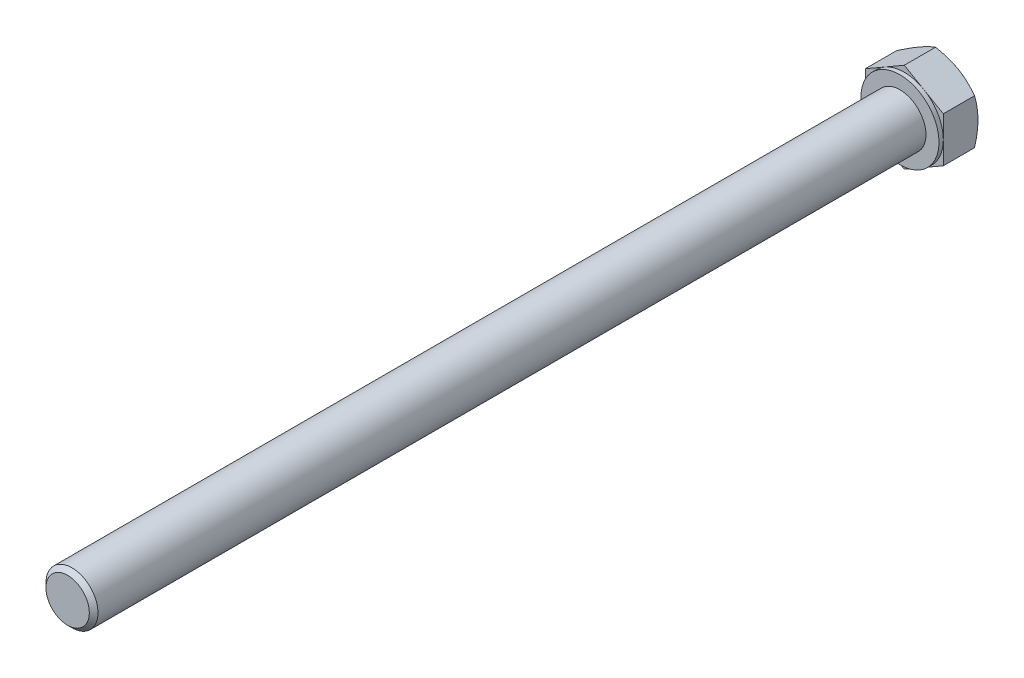
ISO-10303-21;
HEADER;
FILE_DESCRIPTION(('STEP AP214'),'2;1');
FILE_NAME('part.step','',(''),(''),'','','');
FILE_SCHEMA(('AUTOMOTIVE_DESIGN { 1 0 10303 214 1 1 1 1 }'));
ENDSEC;
DATA;
#1=APPLICATION_CONTEXT('core data for automotive mechanical design processes');
#2=APPLICATION_PROTOCOL_DEFINITION('international standard','automotive_design',2000,#1);
#3=PRODUCT_CONTEXT('',#1,'mechanical');
#4=PRODUCT('Part','Part','',(#3));
#5=PRODUCT_RELATED_PRODUCT_CATEGORY('part','',(#4));
#6=PRODUCT_DEFINITION_FORMATION('','',#4);
#7=PRODUCT_DEFINITION_CONTEXT('part definition',#1,'design');
#8=PRODUCT_DEFINITION('design','',#6,#7);
#9=PRODUCT_DEFINITION_SHAPE('','',#8);
#10=(LENGTH_UNIT() NAMED_UNIT(*) SI_UNIT(.MILLI.,.METRE.));
#11=(NAMED_UNIT(*) PLANE_ANGLE_UNIT() SI_UNIT($,.RADIAN.));
#12=(NAMED_UNIT(*) SI_UNIT($,.STERADIAN.) SOLID_ANGLE_UNIT());
#13=UNCERTAINTY_MEASURE_WITH_UNIT(LENGTH_MEASURE(1.E-05),#10,'distance_accuracy_value','');
#14=(GEOMETRIC_REPRESENTATION_CONTEXT(3) GLOBAL_UNCERTAINTY_ASSIGNED_CONTEXT((#13)) GLOBAL_UNIT_ASSIGNED_CONTEXT((#10,
#11,#12)) REPRESENTATION_CONTEXT('',''));
#15=CARTESIAN_POINT('',(0.,0.,0.));
#16=DIRECTION('',(0.,0.,1.));
#17=DIRECTION('',(1.,0.,0.));
#18=AXIS2_PLACEMENT_3D('',#15,#16,#17);
#19=CARTESIAN_POINT('',(0.,0.,0.));
#20=DIRECTION('',(0.,0.,1.));
#21=DIRECTION('',(1.,0.,0.));
#22=AXIS2_PLACEMENT_3D('',#19,#20,#21);
#23=CYLINDRICAL_SURFACE('',#22,2.25);
#24=CARTESIAN_POINT('',(0.,0.,0.));
#25=DIRECTION('',(0.,0.,1.));
#26=DIRECTION('',(1.,0.,0.));
#27=AXIS2_PLACEMENT_3D('',#24,#25,#26);
#28=CIRCLE('',#27,2.25);
#29=CARTESIAN_POINT('',(-2.25,0.,0.));
#30=VERTEX_POINT('',#29);
#31=EDGE_CURVE('E11',#30,#30,#28,.T.);
#32=ORIENTED_EDGE('',*,*,#31,.F.);
#33=EDGE_LOOP('',(#32));
#34=FACE_BOUND('',#33,.T.);
#35=CARTESIAN_POINT('',(0.,0.,-0.25));
#36=DIRECTION('',(0.,0.,1.));
#37=DIRECTION('',(1.,0.,0.));
#38=AXIS2_PLACEMENT_3D('',#35,#36,#37);
#39=CIRCLE('',#38,2.25);
#40=CARTESIAN_POINT('',(-2.25,0.,-0.25));
#41=VERTEX_POINT('',#40);
#42=CARTESIAN_POINT('',(-1.125,-1.94855715851499,-0.25));
#43=VERTEX_POINT('',#42);
#44=EDGE_CURVE('E150',#41,#43,#39,.T.);
#45=ORIENTED_EDGE('',*,*,#44,.T.);
#46=CARTESIAN_POINT('',(0.,0.,-0.25));
#47=DIRECTION('',(0.,0.,1.));
#48=DIRECTION('',(1.,0.,0.));
#49=AXIS2_PLACEMENT_3D('',#46,#47,#48);
#50=CIRCLE('',#49,2.25);
#51=CARTESIAN_POINT('',(1.125,-1.94855715851499,-0.25));
#52=VERTEX_POINT('',#51);
#53=EDGE_CURVE('E148',#43,#52,#50,.T.);
#54=ORIENTED_EDGE('',*,*,#53,.T.);
#55=CARTESIAN_POINT('',(0.,0.,-0.25));
#56=DIRECTION('',(0.,0.,1.));
#57=DIRECTION('',(1.,0.,0.));
#58=AXIS2_PLACEMENT_3D('',#55,#56,#57);
#59=CIRCLE('',#58,2.25);
#60=CARTESIAN_POINT('',(2.25,0.,-0.25));
#61=VERTEX_POINT('',#60);
#62=EDGE_CURVE('E147',#52,#61,#59,.T.);
#63=ORIENTED_EDGE('',*,*,#62,.T.);
#64=CARTESIAN_POINT('',(0.,0.,-0.25));
#65=DIRECTION('',(0.,0.,1.));
#66=DIRECTION('',(1.,0.,0.));
#67=AXIS2_PLACEMENT_3D('',#64,#65,#66);
#68=CIRCLE('',#67,2.25);
#69=CARTESIAN_POINT('',(1.125,1.94855715851499,-0.25));
#70=VERTEX_POINT('',#69);
#71=EDGE_CURVE('E116',#61,#70,#68,.T.);
#72=ORIENTED_EDGE('',*,*,#71,.T.);
#73=CARTESIAN_POINT('',(0.,0.,-0.25));
#74=DIRECTION('',(0.,0.,1.));
#75=DIRECTION('',(1.,0.,0.));
#76=AXIS2_PLACEMENT_3D('',#73,#74,#75);
#77=CIRCLE('',#76,2.25);
#78=CARTESIAN_POINT('',(-1.125,1.94855715851499,-0.25));
#79=VERTEX_POINT('',#78);
#80=EDGE_CURVE('E117',#70,#79,#77,.T.);
#81=ORIENTED_EDGE('',*,*,#80,.T.);
#82=CARTESIAN_POINT('',(0.,0.,-0.25));
#83=DIRECTION('',(0.,0.,1.));
#84=DIRECTION('',(1.,0.,0.));
#85=AXIS2_PLACEMENT_3D('',#82,#83,#84);
#86=CIRCLE('',#85,2.25);
#87=EDGE_CURVE('E262',#79,#41,#86,.T.);
#88=ORIENTED_EDGE('',*,*,#87,.T.);
#89=EDGE_LOOP('',(#45,#54,#63,#72,#81,#88));
#90=FACE_BOUND('',#89,.T.);
#91=ADVANCED_FACE('F16',(#34,#90),#23,.T.);
#92=CARTESIAN_POINT('',(0.,0.,0.));
#93=DIRECTION('',(0.,0.,1.));
#94=DIRECTION('',(1.,0.,0.));
#95=AXIS2_PLACEMENT_3D('',#92,#93,#94);
#96=PLANE('',#95);
#97=CARTESIAN_POINT('',(0.,0.,0.));
#98=DIRECTION('',(0.,0.,-1.));
#99=DIRECTION('',(-1.,0.,0.));
#100=AXIS2_PLACEMENT_3D('',#97,#98,#99);
#101=CIRCLE('',#100,1.5);
#102=CARTESIAN_POINT('',(1.5,0.,0.));
#103=VERTEX_POINT('',#102);
#104=EDGE_CURVE('E256',#103,#103,#101,.T.);
#105=ORIENTED_EDGE('',*,*,#104,.T.);
#106=EDGE_LOOP('',(#105));
#107=FACE_BOUND('',#106,.T.);
#108=ORIENTED_EDGE('',*,*,#31,.T.);
#109=EDGE_LOOP('',(#108));
#110=FACE_BOUND('',#109,.T.);
#111=ADVANCED_FACE('F373',(#107,#110),#96,.T.);
#112=CARTESIAN_POINT('',(0.,0.,-2.251));
#113=DIRECTION('',(0.,0.,1.));
#114=DIRECTION('',(1.,0.,0.));
#115=AXIS2_PLACEMENT_3D('',#112,#113,#114);
#116=PLANE('',#115);
#117=CARTESIAN_POINT('',(0.,0.,-2.251));
#118=DIRECTION('',(0.,0.,-1.));
#119=DIRECTION('',(1.,0.,0.));
#120=AXIS2_PLACEMENT_3D('',#117,#118,#119);
#121=CIRCLE('',#120,2.25);
#122=CARTESIAN_POINT('',(-1.125,1.94855715851499,-2.251));
#123=VERTEX_POINT('',#122);
#124=CARTESIAN_POINT('',(1.125,1.94855715851499,-2.251));
#125=VERTEX_POINT('',#124);
#126=EDGE_CURVE('E212',#123,#125,#121,.T.);
#127=ORIENTED_EDGE('',*,*,#126,.T.);
#128=CARTESIAN_POINT('',(0.,0.,-2.251));
#129=DIRECTION('',(0.,0.,-1.));
#130=DIRECTION('',(1.,0.,0.));
#131=AXIS2_PLACEMENT_3D('',#128,#129,#130);
#132=CIRCLE('',#131,2.25);
#133=CARTESIAN_POINT('',(2.25,0.,-2.251));
#134=VERTEX_POINT('',#133);
#135=EDGE_CURVE('E209',#125,#134,#132,.T.);
#136=ORIENTED_EDGE('',*,*,#135,.T.);
#137=CARTESIAN_POINT('',(0.,0.,-2.251));
#138=DIRECTION('',(0.,0.,-1.));
#139=DIRECTION('',(1.,0.,0.));
#140=AXIS2_PLACEMENT_3D('',#137,#138,#139);
#141=CIRCLE('',#140,2.25);
#142=CARTESIAN_POINT('',(1.125,-1.94855715851499,-2.251));
#143=VERTEX_POINT('',#142);
#144=EDGE_CURVE('E162',#134,#143,#141,.T.);
#145=ORIENTED_EDGE('',*,*,#144,.T.);
#146=CARTESIAN_POINT('',(0.,0.,-2.251));
#147=DIRECTION('',(0.,0.,-1.));
#148=DIRECTION('',(1.,0.,0.));
#149=AXIS2_PLACEMENT_3D('',#146,#147,#148);
#150=CIRCLE('',#149,2.25);
#151=CARTESIAN_POINT('',(-1.125,-1.94855715851499,-2.251));
#152=VERTEX_POINT('',#151);
#153=EDGE_CURVE('E154',#143,#152,#150,.T.);
#154=ORIENTED_EDGE('',*,*,#153,.T.);
#155=CARTESIAN_POINT('',(0.,0.,-2.251));
#156=DIRECTION('',(0.,0.,-1.));
#157=DIRECTION('',(1.,0.,0.));
#158=AXIS2_PLACEMENT_3D('',#155,#156,#157);
#159=CIRCLE('',#158,2.25);
#160=CARTESIAN_POINT('',(-2.25,0.,-2.251));
#161=VERTEX_POINT('',#160);
#162=EDGE_CURVE('E173',#152,#161,#159,.T.);
#163=ORIENTED_EDGE('',*,*,#162,.T.);
#164=CARTESIAN_POINT('',(0.,0.,-2.251));
#165=DIRECTION('',(0.,0.,-1.));
#166=DIRECTION('',(1.,0.,0.));
#167=AXIS2_PLACEMENT_3D('',#164,#165,#166);
#168=CIRCLE('',#167,2.25);
#169=EDGE_CURVE('E239',#161,#123,#168,.T.);
#170=ORIENTED_EDGE('',*,*,#169,.T.);
#171=EDGE_LOOP('',(#127,#136,#145,#154,#163,#170));
#172=FACE_BOUND('',#171,.T.);
#173=ADVANCED_FACE('F205',(#172),#116,.F.);
#174=CARTESIAN_POINT('',(-2.25,-1.29903810567666,-0.25));
#175=DIRECTION('',(-0.5,-0.866025403784439,0.));
#176=DIRECTION('',(0.,0.,-1.));
#177=AXIS2_PLACEMENT_3D('',#174,#175,#176);
#178=PLANE('',#177);
#179=CARTESIAN_POINT('',(-1.125,-1.94855715851499,-2.251));
#180=CARTESIAN_POINT('',(-0.602885682970028,-2.25,-2.251));
#181=CARTESIAN_POINT('',(0.,-2.59807621135332,-2.05003810567666));
#182=(BOUNDED_CURVE() B_SPLINE_CURVE(2,(#179,#180,#181),.UNSPECIFIED.,.F.,
.F.) B_SPLINE_CURVE_WITH_KNOTS((3,3),(0.272027698341248,0.423006583497747),
.UNSPECIFIED.) CURVE() GEOMETRIC_REPRESENTATION_ITEM() RATIONAL_B_SPLINE_CURVE((1.,
1.06963351164521,1.06197202706884)) REPRESENTATION_ITEM(''));
#183=CARTESIAN_POINT('',(0.,-2.59807621135332,-2.05003810567666));
#184=VERTEX_POINT('',#183);
#185=EDGE_CURVE('E157',#152,#184,#182,.T.);
#186=ORIENTED_EDGE('',*,*,#185,.T.);
#187=DIRECTION('',(0.,0.,-1.));
#188=VECTOR('',#187,1.);
#189=CARTESIAN_POINT('',(0.,-2.59807621135332,-0.25));
#190=LINE('',#189,#188);
#191=CARTESIAN_POINT('',(0.,-2.59807621135332,-0.25));
#192=VERTEX_POINT('',#191);
#193=EDGE_CURVE('E317',#192,#184,#190,.T.);
#194=ORIENTED_EDGE('',*,*,#193,.F.);
#195=DIRECTION('',(0.866025403784439,-0.5,0.));
#196=VECTOR('',#195,1.);
#197=CARTESIAN_POINT('',(-2.25,-1.29903810567666,-0.25));
#198=LINE('',#197,#196);
#199=EDGE_CURVE('E20',#43,#192,#198,.T.);
#200=ORIENTED_EDGE('',*,*,#199,.F.);
#201=DIRECTION('',(0.866025403784439,-0.5,0.));
#202=VECTOR('',#201,1.);
#203=CARTESIAN_POINT('',(-2.25,-1.29903810567666,-0.25));
#204=LINE('',#203,#202);
#205=CARTESIAN_POINT('',(-2.25,-1.29903810567666,-0.25));
#206=VERTEX_POINT('',#205);
#207=EDGE_CURVE('E230',#206,#43,#204,.T.);
#208=ORIENTED_EDGE('',*,*,#207,.F.);
#209=DIRECTION('',(0.,0.,-1.));
#210=VECTOR('',#209,1.);
#211=CARTESIAN_POINT('',(-2.25,-1.29903810567666,-0.25));
#212=LINE('',#211,#210);
#213=CARTESIAN_POINT('',(-2.25,-1.29903810567666,-2.05003810567666));
#214=VERTEX_POINT('',#213);
#215=EDGE_CURVE('E27',#206,#214,#212,.T.);
#216=ORIENTED_EDGE('',*,*,#215,.T.);
#217=CARTESIAN_POINT('',(-2.25,-1.29903810567666,-2.05003810567666));
#218=CARTESIAN_POINT('',(-1.64711431702998,-1.64711431702998,-2.251));
#219=CARTESIAN_POINT('',(-1.125,-1.94855715851499,-2.251));
#220=(BOUNDED_CURVE() B_SPLINE_CURVE(2,(#217,#218,#219),.UNSPECIFIED.,.F.,
.F.) B_SPLINE_CURVE_WITH_KNOTS((3,3),(0.121048813184749,0.272027698341248),
.UNSPECIFIED.) CURVE() GEOMETRIC_REPRESENTATION_ITEM() RATIONAL_B_SPLINE_CURVE((1.06197202706884,
1.06963351164521,1.)) REPRESENTATION_ITEM(''));
#221=EDGE_CURVE('E174',#214,#152,#220,.T.);
#222=ORIENTED_EDGE('',*,*,#221,.T.);
#223=EDGE_LOOP('',(#186,#194,#200,#208,#216,#222));
#224=FACE_BOUND('',#223,.T.);
#225=ADVANCED_FACE('F347',(#224),#178,.T.);
#226=CARTESIAN_POINT('',(-2.25,1.29903810567666,-0.25));
#227=DIRECTION('',(-1.,0.,0.));
#228=DIRECTION('',(0.,0.,1.));
#229=AXIS2_PLACEMENT_3D('',#226,#227,#228);
#230=PLANE('',#229);
#231=CARTESIAN_POINT('',(-2.25,0.,-2.251));
#232=CARTESIAN_POINT('',(-2.25,-0.602885682970027,-2.251));
#233=CARTESIAN_POINT('',(-2.25,-1.29903810567666,-2.05003810567666));
#234=(BOUNDED_CURVE() B_SPLINE_CURVE(2,(#231,#232,#233),.UNSPECIFIED.,.F.,
.F.) B_SPLINE_CURVE_WITH_KNOTS((3,3),(0.272027698341248,0.423006583497747),
.UNSPECIFIED.) CURVE() GEOMETRIC_REPRESENTATION_ITEM() RATIONAL_B_SPLINE_CURVE((1.,
1.06963351164522,1.06197202706885)) REPRESENTATION_ITEM(''));
#235=EDGE_CURVE('E168',#161,#214,#234,.T.);
#236=ORIENTED_EDGE('',*,*,#235,.T.);
#237=ORIENTED_EDGE('',*,*,#215,.F.);
#238=DIRECTION('',(0.,-1.,0.));
#239=VECTOR('',#238,1.);
#240=CARTESIAN_POINT('',(-2.25,1.29903810567666,-0.25));
#241=LINE('',#240,#239);
#242=EDGE_CURVE('E153',#41,#206,#241,.T.);
#243=ORIENTED_EDGE('',*,*,#242,.F.);
#244=DIRECTION('',(0.,-1.,0.));
#245=VECTOR('',#244,1.);
#246=CARTESIAN_POINT('',(-2.25,1.29903810567666,-0.25));
#247=LINE('',#246,#245);
#248=CARTESIAN_POINT('',(-2.25,1.29903810567666,-0.25));
#249=VERTEX_POINT('',#248);
#250=EDGE_CURVE('E167',#249,#41,#247,.T.);
#251=ORIENTED_EDGE('',*,*,#250,.F.);
#252=DIRECTION('',(0.,0.,-1.));
#253=VECTOR('',#252,1.);
#254=CARTESIAN_POINT('',(-2.25,1.29903810567666,-0.25));
#255=LINE('',#254,#253);
#256=CARTESIAN_POINT('',(-2.25,1.29903810567666,-2.05003810567666));
#257=VERTEX_POINT('',#256);
#258=EDGE_CURVE('E270',#249,#257,#255,.T.);
#259=ORIENTED_EDGE('',*,*,#258,.T.);
#260=CARTESIAN_POINT('',(-2.25,1.29903810567666,-2.05003810567666));
#261=CARTESIAN_POINT('',(-2.25,0.602885682970027,-2.251));
#262=CARTESIAN_POINT('',(-2.25,0.,-2.251));
#263=(BOUNDED_CURVE() B_SPLINE_CURVE(2,(#260,#261,#262),.UNSPECIFIED.,.F.,
.F.) B_SPLINE_CURVE_WITH_KNOTS((3,3),(0.121048813184749,0.272027698341248),
.UNSPECIFIED.) CURVE() GEOMETRIC_REPRESENTATION_ITEM() RATIONAL_B_SPLINE_CURVE((1.06197202706885,
1.06963351164522,1.)) REPRESENTATION_ITEM(''));
#264=EDGE_CURVE('E286',#257,#161,#263,.T.);
#265=ORIENTED_EDGE('',*,*,#264,.T.);
#266=EDGE_LOOP('',(#236,#237,#243,#251,#259,#265));
#267=FACE_BOUND('',#266,.T.);
#268=ADVANCED_FACE('F388',(#267),#230,.T.);
#269=CARTESIAN_POINT('',(0.,2.59807621135332,-0.25));
#270=DIRECTION('',(-0.5,0.866025403784439,0.));
#271=DIRECTION('',(0.,0.,1.));
#272=AXIS2_PLACEMENT_3D('',#269,#270,#271);
#273=PLANE('',#272);
#274=CARTESIAN_POINT('',(-1.125,1.94855715851499,-2.251));
#275=CARTESIAN_POINT('',(-1.64711431702998,1.64711431702998,-2.251));
#276=CARTESIAN_POINT('',(-2.25,1.29903810567666,-2.05003810567666));
#277=(BOUNDED_CURVE() B_SPLINE_CURVE(2,(#274,#275,#276),.UNSPECIFIED.,.F.,
.F.) B_SPLINE_CURVE_WITH_KNOTS((3,3),(0.272027698341248,0.423006583497747),
.UNSPECIFIED.) CURVE() GEOMETRIC_REPRESENTATION_ITEM() RATIONAL_B_SPLINE_CURVE((1.,
1.06963351164521,1.06197202706884)) REPRESENTATION_ITEM(''));
#278=EDGE_CURVE('E269',#123,#257,#277,.T.);
#279=ORIENTED_EDGE('',*,*,#278,.T.);
#280=ORIENTED_EDGE('',*,*,#258,.F.);
#281=DIRECTION('',(-0.866025403784439,-0.5,0.));
#282=VECTOR('',#281,1.);
#283=CARTESIAN_POINT('',(0.,2.59807621135332,-0.25));
#284=LINE('',#283,#282);
#285=EDGE_CURVE('E110',#79,#249,#284,.T.);
#286=ORIENTED_EDGE('',*,*,#285,.F.);
#287=DIRECTION('',(-0.866025403784439,-0.5,0.));
#288=VECTOR('',#287,1.);
#289=CARTESIAN_POINT('',(0.,2.59807621135332,-0.25));
#290=LINE('',#289,#288);
#291=CARTESIAN_POINT('',(0.,2.59807621135332,-0.25));
#292=VERTEX_POINT('',#291);
#293=EDGE_CURVE('E102',#292,#79,#290,.T.);
#294=ORIENTED_EDGE('',*,*,#293,.F.);
#295=DIRECTION('',(0.,0.,-1.));
#296=VECTOR('',#295,1.);
#297=CARTESIAN_POINT('',(0.,2.59807621135332,-0.25));
#298=LINE('',#297,#296);
#299=CARTESIAN_POINT('',(0.,2.59807621135332,-2.05003810567666));
#300=VERTEX_POINT('',#299);
#301=EDGE_CURVE('E107',#292,#300,#298,.T.);
#302=ORIENTED_EDGE('',*,*,#301,.T.);
#303=CARTESIAN_POINT('',(0.,2.59807621135332,-2.05003810567666));
#304=CARTESIAN_POINT('',(-0.602885682970029,2.25,-2.251));
#305=CARTESIAN_POINT('',(-1.125,1.94855715851499,-2.251));
#306=(BOUNDED_CURVE() B_SPLINE_CURVE(2,(#303,#304,#305),.UNSPECIFIED.,.F.,
.F.) B_SPLINE_CURVE_WITH_KNOTS((3,3),(0.12104881318475,0.272027698341248),
.UNSPECIFIED.) CURVE() GEOMETRIC_REPRESENTATION_ITEM() RATIONAL_B_SPLINE_CURVE((1.06197202706884,
1.06963351164521,1.)) REPRESENTATION_ITEM(''));
#307=EDGE_CURVE('E143',#300,#123,#306,.T.);
#308=ORIENTED_EDGE('',*,*,#307,.T.);
#309=EDGE_LOOP('',(#279,#280,#286,#294,#302,#308));
#310=FACE_BOUND('',#309,.T.);
#311=ADVANCED_FACE('F105',(#310),#273,.T.);
#312=CARTESIAN_POINT('',(0.,0.,-0.25));
#313=DIRECTION('',(0.,0.,1.));
#314=DIRECTION('',(1.,0.,0.));
#315=AXIS2_PLACEMENT_3D('',#312,#313,#314);
#316=PLANE('',#315);
#317=ORIENTED_EDGE('',*,*,#44,.F.);
#318=ORIENTED_EDGE('',*,*,#242,.T.);
#319=ORIENTED_EDGE('',*,*,#207,.T.);
#320=EDGE_LOOP('',(#317,#318,#319));
#321=FACE_BOUND('',#320,.T.);
#322=ADVANCED_FACE('F384',(#321),#316,.T.);
#323=CARTESIAN_POINT('',(0.,0.,-0.25));
#324=DIRECTION('',(0.,0.,1.));
#325=DIRECTION('',(1.,0.,0.));
#326=AXIS2_PLACEMENT_3D('',#323,#324,#325);
#327=PLANE('',#326);
#328=ORIENTED_EDGE('',*,*,#53,.F.);
#329=ORIENTED_EDGE('',*,*,#199,.T.);
#330=DIRECTION('',(0.866025403784439,0.5,0.));
#331=VECTOR('',#330,1.);
#332=CARTESIAN_POINT('',(0.,-2.59807621135332,-0.25));
#333=LINE('',#332,#331);
#334=EDGE_CURVE('E282',#192,#52,#333,.T.);
#335=ORIENTED_EDGE('',*,*,#334,.T.);
#336=EDGE_LOOP('',(#328,#329,#335));
#337=FACE_BOUND('',#336,.T.);
#338=ADVANCED_FACE('F343',(#337),#327,.T.);
#339=CARTESIAN_POINT('',(0.,0.,-0.25));
#340=DIRECTION('',(0.,0.,1.));
#341=DIRECTION('',(1.,0.,0.));
#342=AXIS2_PLACEMENT_3D('',#339,#340,#341);
#343=PLANE('',#342);
#344=ORIENTED_EDGE('',*,*,#62,.F.);
#345=DIRECTION('',(0.866025403784439,0.5,0.));
#346=VECTOR('',#345,1.);
#347=CARTESIAN_POINT('',(0.,-2.59807621135332,-0.25));
#348=LINE('',#347,#346);
#349=CARTESIAN_POINT('',(2.25,-1.29903810567666,-0.25));
#350=VERTEX_POINT('',#349);
#351=EDGE_CURVE('E161',#52,#350,#348,.T.);
#352=ORIENTED_EDGE('',*,*,#351,.T.);
#353=DIRECTION('',(0.,1.,0.));
#354=VECTOR('',#353,1.);
#355=CARTESIAN_POINT('',(2.25,-1.29903810567666,-0.25));
#356=LINE('',#355,#354);
#357=EDGE_CURVE('E132',#350,#61,#356,.T.);
#358=ORIENTED_EDGE('',*,*,#357,.T.);
#359=EDGE_LOOP('',(#344,#352,#358));
#360=FACE_BOUND('',#359,.T.);
#361=ADVANCED_FACE('F349',(#360),#343,.T.);
#362=CARTESIAN_POINT('',(0.,0.,-0.25));
#363=DIRECTION('',(0.,0.,1.));
#364=DIRECTION('',(1.,0.,0.));
#365=AXIS2_PLACEMENT_3D('',#362,#363,#364);
#366=PLANE('',#365);
#367=ORIENTED_EDGE('',*,*,#71,.F.);
#368=DIRECTION('',(0.,1.,0.));
#369=VECTOR('',#368,1.);
#370=CARTESIAN_POINT('',(2.25,-1.29903810567666,-0.25));
#371=LINE('',#370,#369);
#372=CARTESIAN_POINT('',(2.25,1.29903810567666,-0.25));
#373=VERTEX_POINT('',#372);
#374=EDGE_CURVE('E139',#61,#373,#371,.T.);
#375=ORIENTED_EDGE('',*,*,#374,.T.);
#376=DIRECTION('',(-0.866025403784439,0.5,0.));
#377=VECTOR('',#376,1.);
#378=CARTESIAN_POINT('',(2.25,1.29903810567666,-0.25));
#379=LINE('',#378,#377);
#380=EDGE_CURVE('E124',#373,#70,#379,.T.);
#381=ORIENTED_EDGE('',*,*,#380,.T.);
#382=EDGE_LOOP('',(#367,#375,#381));
#383=FACE_BOUND('',#382,.T.);
#384=ADVANCED_FACE('F401',(#383),#366,.T.);
#385=CARTESIAN_POINT('',(0.,0.,-0.25));
#386=DIRECTION('',(0.,0.,1.));
#387=DIRECTION('',(1.,0.,0.));
#388=AXIS2_PLACEMENT_3D('',#385,#386,#387);
#389=PLANE('',#388);
#390=ORIENTED_EDGE('',*,*,#80,.F.);
#391=DIRECTION('',(-0.866025403784439,0.5,0.));
#392=VECTOR('',#391,1.);
#393=CARTESIAN_POINT('',(2.25,1.29903810567666,-0.25));
#394=LINE('',#393,#392);
#395=EDGE_CURVE('E120',#70,#292,#394,.T.);
#396=ORIENTED_EDGE('',*,*,#395,.T.);
#397=ORIENTED_EDGE('',*,*,#293,.T.);
#398=EDGE_LOOP('',(#390,#396,#397));
#399=FACE_BOUND('',#398,.T.);
#400=ADVANCED_FACE('F18',(#399),#389,.T.);
#401=CARTESIAN_POINT('',(0.,0.,-0.25));
#402=DIRECTION('',(0.,0.,1.));
#403=DIRECTION('',(1.,0.,0.));
#404=AXIS2_PLACEMENT_3D('',#401,#402,#403);
#405=PLANE('',#404);
#406=ORIENTED_EDGE('',*,*,#87,.F.);
#407=ORIENTED_EDGE('',*,*,#285,.T.);
#408=ORIENTED_EDGE('',*,*,#250,.T.);
#409=EDGE_LOOP('',(#406,#407,#408));
#410=FACE_BOUND('',#409,.T.);
#411=ADVANCED_FACE('F360',(#410),#405,.T.);
#412=CARTESIAN_POINT('',(0.,0.,48.));
#413=DIRECTION('',(0.,0.,-1.));
#414=DIRECTION('',(-1.,0.,0.));
#415=AXIS2_PLACEMENT_3D('',#412,#413,#414);
#416=PLANE('',#415);
#417=CARTESIAN_POINT('',(0.,0.,48.));
#418=DIRECTION('',(0.,0.,-1.));
#419=DIRECTION('',(-1.,0.,0.));
#420=AXIS2_PLACEMENT_3D('',#417,#418,#419);
#421=CIRCLE('',#420,1.25);
#422=CARTESIAN_POINT('',(1.25,0.,48.));
#423=VERTEX_POINT('',#422);
#424=EDGE_CURVE('E240',#423,#423,#421,.T.);
#425=ORIENTED_EDGE('',*,*,#424,.F.);
#426=EDGE_LOOP('',(#425));
#427=FACE_BOUND('',#426,.T.);
#428=ADVANCED_FACE('F357',(#427),#416,.F.);
#429=CARTESIAN_POINT('',(0.,0.,0.));
#430=DIRECTION('',(0.,0.,-1.));
#431=DIRECTION('',(-1.,0.,0.));
#432=AXIS2_PLACEMENT_3D('',#429,#430,#431);
#433=CYLINDRICAL_SURFACE('',#432,1.5);
#434=CARTESIAN_POINT('',(0.,0.,47.75));
#435=DIRECTION('',(0.,0.,1.));
#436=DIRECTION('',(-1.,0.,0.));
#437=AXIS2_PLACEMENT_3D('',#434,#435,#436);
#438=CIRCLE('',#437,1.5);
#439=CARTESIAN_POINT('',(1.5,0.,47.75));
#440=VERTEX_POINT('',#439);
#441=EDGE_CURVE('E245',#440,#440,#438,.T.);
#442=ORIENTED_EDGE('',*,*,#441,.F.);
#443=EDGE_LOOP('',(#442));
#444=FACE_BOUND('',#443,.T.);
#445=ORIENTED_EDGE('',*,*,#104,.F.);
#446=EDGE_LOOP('',(#445));
#447=FACE_BOUND('',#446,.T.);
#448=ADVANCED_FACE('F359',(#444,#447),#433,.T.);
#449=CARTESIAN_POINT('',(0.,0.,47.875));
#450=DIRECTION('',(0.,0.,-1.));
#451=DIRECTION('',(-1.,0.,0.));
#452=AXIS2_PLACEMENT_3D('',#449,#450,#451);
#453=CONICAL_SURFACE('',#452,1.375,0.785398163397441);
#454=ORIENTED_EDGE('',*,*,#441,.T.);
#455=EDGE_LOOP('',(#454));
#456=FACE_BOUND('',#455,.T.);
#457=ORIENTED_EDGE('',*,*,#424,.T.);
#458=EDGE_LOOP('',(#457));
#459=FACE_BOUND('',#458,.T.);
#460=ADVANCED_FACE('F355',(#456,#459),#453,.T.);
#461=CARTESIAN_POINT('',(2.25,1.29903810567666,-0.25));
#462=DIRECTION('',(0.5,0.866025403784439,0.));
#463=DIRECTION('',(0.,0.,1.));
#464=AXIS2_PLACEMENT_3D('',#461,#462,#463);
#465=PLANE('',#464);
#466=CARTESIAN_POINT('',(2.25000000000001,1.29903810567666,-2.05003810567666));
#467=CARTESIAN_POINT('',(1.64711431702998,1.64711431702998,-2.251));
#468=CARTESIAN_POINT('',(1.125,1.94855715851499,-2.251));
#469=(BOUNDED_CURVE() B_SPLINE_CURVE(2,(#466,#467,#468),.UNSPECIFIED.,.F.,
.F.) B_SPLINE_CURVE_WITH_KNOTS((3,3),(0.121048813184749,0.272027698341248),
.UNSPECIFIED.) CURVE() GEOMETRIC_REPRESENTATION_ITEM() RATIONAL_B_SPLINE_CURVE((1.06197202706884,
1.06963351164521,1.)) REPRESENTATION_ITEM(''));
#470=CARTESIAN_POINT('',(2.25,1.29903810567666,-2.05003810567666));
#471=VERTEX_POINT('',#470);
#472=EDGE_CURVE('E215',#471,#125,#469,.T.);
#473=ORIENTED_EDGE('',*,*,#472,.T.);
#474=CARTESIAN_POINT('',(1.125,1.94855715851499,-2.251));
#475=CARTESIAN_POINT('',(0.602885682970026,2.25,-2.251));
#476=CARTESIAN_POINT('',(0.,2.59807621135332,-2.05003810567666));
#477=(BOUNDED_CURVE() B_SPLINE_CURVE(2,(#474,#475,#476),.UNSPECIFIED.,.F.,
.F.) B_SPLINE_CURVE_WITH_KNOTS((3,3),(0.272027698341248,0.423006583497747),
.UNSPECIFIED.) CURVE() GEOMETRIC_REPRESENTATION_ITEM() RATIONAL_B_SPLINE_CURVE((1.,
1.06963351164521,1.06197202706884)) REPRESENTATION_ITEM(''));
#478=EDGE_CURVE('E130',#125,#300,#477,.T.);
#479=ORIENTED_EDGE('',*,*,#478,.T.);
#480=ORIENTED_EDGE('',*,*,#301,.F.);
#481=ORIENTED_EDGE('',*,*,#395,.F.);
#482=ORIENTED_EDGE('',*,*,#380,.F.);
#483=DIRECTION('',(0.,0.,-1.));
#484=VECTOR('',#483,1.);
#485=CARTESIAN_POINT('',(2.25,1.29903810567666,-0.25));
#486=LINE('',#485,#484);
#487=EDGE_CURVE('E323',#373,#471,#486,.T.);
#488=ORIENTED_EDGE('',*,*,#487,.T.);
#489=EDGE_LOOP('',(#473,#479,#480,#481,#482,#488));
#490=FACE_BOUND('',#489,.T.);
#491=ADVANCED_FACE('F128',(#490),#465,.T.);
#492=CARTESIAN_POINT('',(2.25,-1.29903810567666,-0.25));
#493=DIRECTION('',(1.,0.,0.));
#494=DIRECTION('',(0.,0.,-1.));
#495=AXIS2_PLACEMENT_3D('',#492,#493,#494);
#496=PLANE('',#495);
#497=CARTESIAN_POINT('',(2.25000000000001,-1.29903810567666,-2.05003810567666));
#498=CARTESIAN_POINT('',(2.25,-0.602885682970028,-2.251));
#499=CARTESIAN_POINT('',(2.25,0.,-2.251));
#500=(BOUNDED_CURVE() B_SPLINE_CURVE(2,(#497,#498,#499),.UNSPECIFIED.,.F.,
.F.) B_SPLINE_CURVE_WITH_KNOTS((3,3),(0.121048813184749,0.272027698341248),
.UNSPECIFIED.) CURVE() GEOMETRIC_REPRESENTATION_ITEM() RATIONAL_B_SPLINE_CURVE((1.06197202706885,
1.06963351164522,1.)) REPRESENTATION_ITEM(''));
#501=CARTESIAN_POINT('',(2.25,-1.29903810567666,-2.05003810567666));
#502=VERTEX_POINT('',#501);
#503=EDGE_CURVE('E165',#502,#134,#500,.T.);
#504=ORIENTED_EDGE('',*,*,#503,.T.);
#505=CARTESIAN_POINT('',(2.25,0.,-2.251));
#506=CARTESIAN_POINT('',(2.25,0.602885682970027,-2.251));
#507=CARTESIAN_POINT('',(2.25,1.29903810567666,-2.05003810567666));
#508=(BOUNDED_CURVE() B_SPLINE_CURVE(2,(#505,#506,#507),.UNSPECIFIED.,.F.,
.F.) B_SPLINE_CURVE_WITH_KNOTS((3,3),(0.272027698341248,0.423006583497747),
.UNSPECIFIED.) CURVE() GEOMETRIC_REPRESENTATION_ITEM() RATIONAL_B_SPLINE_CURVE((1.,
1.06963351164522,1.06197202706885)) REPRESENTATION_ITEM(''));
#509=EDGE_CURVE('E216',#134,#471,#508,.T.);
#510=ORIENTED_EDGE('',*,*,#509,.T.);
#511=ORIENTED_EDGE('',*,*,#487,.F.);
#512=ORIENTED_EDGE('',*,*,#374,.F.);
#513=ORIENTED_EDGE('',*,*,#357,.F.);
#514=DIRECTION('',(0.,0.,-1.));
#515=VECTOR('',#514,1.);
#516=CARTESIAN_POINT('',(2.25,-1.29903810567666,-0.25));
#517=LINE('',#516,#515);
#518=EDGE_CURVE('E158',#350,#502,#517,.T.);
#519=ORIENTED_EDGE('',*,*,#518,.T.);
#520=EDGE_LOOP('',(#504,#510,#511,#512,#513,#519));
#521=FACE_BOUND('',#520,.T.);
#522=ADVANCED_FACE('F223',(#521),#496,.T.);
#523=CARTESIAN_POINT('',(0.,-2.59807621135332,-0.25));
#524=DIRECTION('',(0.5,-0.866025403784439,0.));
#525=DIRECTION('',(0.,0.,-1.));
#526=AXIS2_PLACEMENT_3D('',#523,#524,#525);
#527=PLANE('',#526);
#528=CARTESIAN_POINT('',(0.,-2.59807621135332,-2.05003810567666));
#529=CARTESIAN_POINT('',(0.602885682970026,-2.25,-2.251));
#530=CARTESIAN_POINT('',(1.125,-1.94855715851499,-2.251));
#531=(BOUNDED_CURVE() B_SPLINE_CURVE(2,(#528,#529,#530),.UNSPECIFIED.,.F.,
.F.) B_SPLINE_CURVE_WITH_KNOTS((3,3),(0.12104881318475,0.272027698341248),
.UNSPECIFIED.) CURVE() GEOMETRIC_REPRESENTATION_ITEM() RATIONAL_B_SPLINE_CURVE((1.06197202706884,
1.06963351164521,1.)) REPRESENTATION_ITEM(''));
#532=EDGE_CURVE('E191',#184,#143,#531,.T.);
#533=ORIENTED_EDGE('',*,*,#532,.T.);
#534=CARTESIAN_POINT('',(1.125,-1.94855715851499,-2.251));
#535=CARTESIAN_POINT('',(1.64711431702998,-1.64711431702998,-2.251));
#536=CARTESIAN_POINT('',(2.25,-1.29903810567666,-2.05003810567666));
#537=(BOUNDED_CURVE() B_SPLINE_CURVE(2,(#534,#535,#536),.UNSPECIFIED.,.F.,
.F.) B_SPLINE_CURVE_WITH_KNOTS((3,3),(0.272027698341248,0.423006583497747),
.UNSPECIFIED.) CURVE() GEOMETRIC_REPRESENTATION_ITEM() RATIONAL_B_SPLINE_CURVE((1.,
1.06963351164522,1.06197202706885)) REPRESENTATION_ITEM(''));
#538=EDGE_CURVE('E156',#143,#502,#537,.T.);
#539=ORIENTED_EDGE('',*,*,#538,.T.);
#540=ORIENTED_EDGE('',*,*,#518,.F.);
#541=ORIENTED_EDGE('',*,*,#351,.F.);
#542=ORIENTED_EDGE('',*,*,#334,.F.);
#543=ORIENTED_EDGE('',*,*,#193,.T.);
#544=EDGE_LOOP('',(#533,#539,#540,#541,#542,#543));
#545=FACE_BOUND('',#544,.T.);
#546=ADVANCED_FACE('F188',(#545),#527,.T.);
#547=CARTESIAN_POINT('',(0.,0.,-1.90458983848622));
#548=DIRECTION('',(0.,0.,1.));
#549=DIRECTION('',(1.,0.,0.));
#550=AXIS2_PLACEMENT_3D('',#547,#548,#549);
#551=CONICAL_SURFACE('',#550,2.85,1.0471975511966);
#552=ORIENTED_EDGE('',*,*,#478,.F.);
#553=ORIENTED_EDGE('',*,*,#126,.F.);
#554=ORIENTED_EDGE('',*,*,#307,.F.);
#555=EDGE_LOOP('',(#552,#553,#554));
#556=FACE_BOUND('',#555,.T.);
#557=ADVANCED_FACE('F402',(#556),#551,.T.);
#558=CARTESIAN_POINT('',(0.,0.,-1.90458983848622));
#559=DIRECTION('',(0.,0.,1.));
#560=DIRECTION('',(1.,0.,0.));
#561=AXIS2_PLACEMENT_3D('',#558,#559,#560);
#562=CONICAL_SURFACE('',#561,2.85,1.0471975511966);
#563=ORIENTED_EDGE('',*,*,#509,.F.);
#564=ORIENTED_EDGE('',*,*,#135,.F.);
#565=ORIENTED_EDGE('',*,*,#472,.F.);
#566=EDGE_LOOP('',(#563,#564,#565));
#567=FACE_BOUND('',#566,.T.);
#568=ADVANCED_FACE('F219',(#567),#562,.T.);
#569=CARTESIAN_POINT('',(0.,0.,-1.90458983848622));
#570=DIRECTION('',(0.,0.,1.));
#571=DIRECTION('',(1.,0.,0.));
#572=AXIS2_PLACEMENT_3D('',#569,#570,#571);
#573=CONICAL_SURFACE('',#572,2.85,1.0471975511966);
#574=ORIENTED_EDGE('',*,*,#538,.F.);
#575=ORIENTED_EDGE('',*,*,#144,.F.);
#576=ORIENTED_EDGE('',*,*,#503,.F.);
#577=EDGE_LOOP('',(#574,#575,#576));
#578=FACE_BOUND('',#577,.T.);
#579=ADVANCED_FACE('F196',(#578),#573,.T.);
#580=CARTESIAN_POINT('',(0.,0.,-1.90458983848622));
#581=DIRECTION('',(0.,0.,1.));
#582=DIRECTION('',(1.,0.,0.));
#583=AXIS2_PLACEMENT_3D('',#580,#581,#582);
#584=CONICAL_SURFACE('',#583,2.85,1.0471975511966);
#585=ORIENTED_EDGE('',*,*,#532,.F.);
#586=ORIENTED_EDGE('',*,*,#185,.F.);
#587=ORIENTED_EDGE('',*,*,#153,.F.);
#588=EDGE_LOOP('',(#585,#586,#587));
#589=FACE_BOUND('',#588,.T.);
#590=ADVANCED_FACE('F201',(#589),#584,.T.);
#591=CARTESIAN_POINT('',(0.,0.,-1.90458983848622));
#592=DIRECTION('',(0.,0.,1.));
#593=DIRECTION('',(1.,0.,0.));
#594=AXIS2_PLACEMENT_3D('',#591,#592,#593);
#595=CONICAL_SURFACE('',#594,2.85,1.0471975511966);
#596=ORIENTED_EDGE('',*,*,#221,.F.);
#597=ORIENTED_EDGE('',*,*,#235,.F.);
#598=ORIENTED_EDGE('',*,*,#162,.F.);
#599=EDGE_LOOP('',(#596,#597,#598));
#600=FACE_BOUND('',#599,.T.);
#601=ADVANCED_FACE('F395',(#600),#595,.T.);
#602=CARTESIAN_POINT('',(0.,0.,-1.90458983848622));
#603=DIRECTION('',(0.,0.,1.));
#604=DIRECTION('',(1.,0.,0.));
#605=AXIS2_PLACEMENT_3D('',#602,#603,#604);
#606=CONICAL_SURFACE('',#605,2.85,1.0471975511966);
#607=ORIENTED_EDGE('',*,*,#264,.F.);
#608=ORIENTED_EDGE('',*,*,#278,.F.);
#609=ORIENTED_EDGE('',*,*,#169,.F.);
#610=EDGE_LOOP('',(#607,#608,#609));
#611=FACE_BOUND('',#610,.T.);
#612=ADVANCED_FACE('F392',(#611),#606,.T.);
#613=CLOSED_SHELL('',(#91,#111,#173,#225,#268,#311,#322,#338,#361,#384,#400,#411,#428,#448,#460,
#491,#522,#546,#557,#568,#579,#590,#601,#612));
#614=MANIFOLD_SOLID_BREP('B1',#613);
#615=ADVANCED_BREP_SHAPE_REPRESENTATION('',(#18,#614),#14);
#616=SHAPE_DEFINITION_REPRESENTATION(#9,#615);
ENDSEC;
END-ISO-10303-21;
